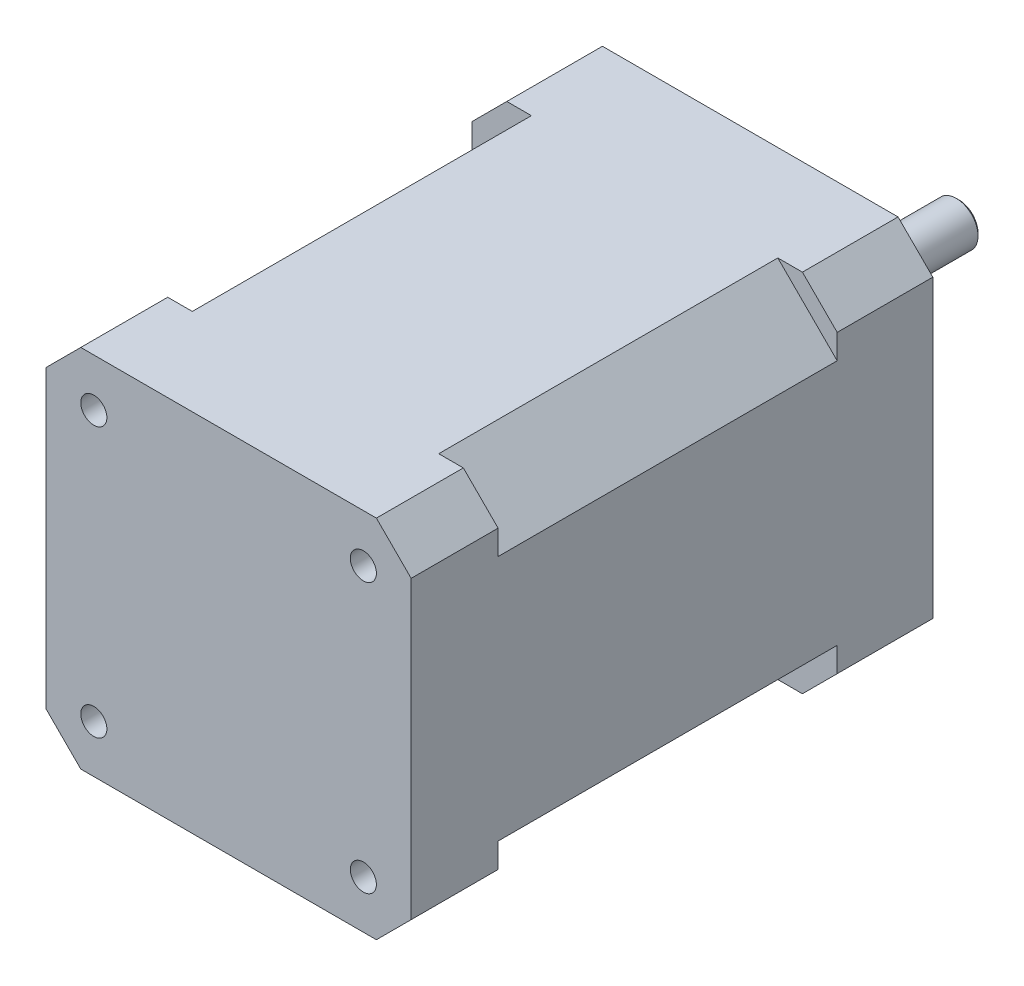
ISO-10303-21;
HEADER;
FILE_DESCRIPTION(('STEP AP214'),'2;1');
FILE_NAME('part.step','',(''),(''),'','','');
FILE_SCHEMA(('AUTOMOTIVE_DESIGN { 1 0 10303 214 1 1 1 1 }'));
ENDSEC;
DATA;
#1=APPLICATION_CONTEXT('core data for automotive mechanical design processes');
#2=APPLICATION_PROTOCOL_DEFINITION('international standard','automotive_design',2000,#1);
#3=PRODUCT_CONTEXT('',#1,'mechanical');
#4=PRODUCT('Part','Part','',(#3));
#5=PRODUCT_RELATED_PRODUCT_CATEGORY('part','',(#4));
#6=PRODUCT_DEFINITION_FORMATION('','',#4);
#7=PRODUCT_DEFINITION_CONTEXT('part definition',#1,'design');
#8=PRODUCT_DEFINITION('design','',#6,#7);
#9=PRODUCT_DEFINITION_SHAPE('','',#8);
#10=(LENGTH_UNIT() NAMED_UNIT(*) SI_UNIT(.MILLI.,.METRE.));
#11=(NAMED_UNIT(*) PLANE_ANGLE_UNIT() SI_UNIT($,.RADIAN.));
#12=(NAMED_UNIT(*) SI_UNIT($,.STERADIAN.) SOLID_ANGLE_UNIT());
#13=UNCERTAINTY_MEASURE_WITH_UNIT(LENGTH_MEASURE(1.E-05),#10,'distance_accuracy_value','');
#14=(GEOMETRIC_REPRESENTATION_CONTEXT(3) GLOBAL_UNCERTAINTY_ASSIGNED_CONTEXT((#13)) GLOBAL_UNIT_ASSIGNED_CONTEXT((#10,
#11,#12)) REPRESENTATION_CONTEXT('',''));
#15=CARTESIAN_POINT('',(0.,0.,0.));
#16=DIRECTION('',(0.,0.,1.));
#17=DIRECTION('',(1.,0.,0.));
#18=AXIS2_PLACEMENT_3D('',#15,#16,#17);
#19=CARTESIAN_POINT('',(8.50746961881451,-12.297619047619,60.));
#20=DIRECTION('',(-0.707106781186547,0.707106781186549,0.));
#21=DIRECTION('',(-0.707106781186549,-0.707106781186546,0.));
#22=AXIS2_PLACEMENT_3D('',#19,#20,#21);
#23=PLANE('',#22);
#24=DIRECTION('',(-0.707106781186548,-0.707106781186547,0.));
#25=VECTOR('',#24,1.);
#26=CARTESIAN_POINT('',(8.50746961881452,-12.297619047619,50.));
#27=LINE('',#26,#25);
#28=CARTESIAN_POINT('',(8.50746961881452,-12.297619047619,50.));
#29=VERTEX_POINT('',#28);
#30=CARTESIAN_POINT('',(4.50746961881449,-16.2976190476191,50.));
#31=VERTEX_POINT('',#30);
#32=EDGE_CURVE('E200',#29,#31,#27,.T.);
#33=ORIENTED_EDGE('',*,*,#32,.F.);
#34=DIRECTION('',(0.,0.,-1.));
#35=VECTOR('',#34,1.);
#36=CARTESIAN_POINT('',(8.50746961881451,-12.297619047619,60.));
#37=LINE('',#36,#35);
#38=CARTESIAN_POINT('',(8.50746961881451,-12.297619047619,60.));
#39=VERTEX_POINT('',#38);
#40=EDGE_CURVE('E212',#39,#29,#37,.T.);
#41=ORIENTED_EDGE('',*,*,#40,.F.);
#42=DIRECTION('',(-0.707106781186549,-0.707106781186546,0.));
#43=VECTOR('',#42,1.);
#44=CARTESIAN_POINT('',(-14.4925303811855,-35.297619047619,60.));
#45=LINE('',#44,#43);
#46=CARTESIAN_POINT('',(4.50746961881449,-16.2976190476191,60.));
#47=VERTEX_POINT('',#46);
#48=EDGE_CURVE('E256',#47,#39,#45,.F.);
#49=ORIENTED_EDGE('',*,*,#48,.F.);
#50=DIRECTION('',(0.,0.,1.));
#51=VECTOR('',#50,1.);
#52=CARTESIAN_POINT('',(4.50746961881449,-16.2976190476191,60.));
#53=LINE('',#52,#51);
#54=EDGE_CURVE('E213',#31,#47,#53,.T.);
#55=ORIENTED_EDGE('',*,*,#54,.F.);
#56=EDGE_LOOP('',(#33,#41,#49,#55));
#57=FACE_BOUND('',#56,.T.);
#58=ADVANCED_FACE('F34',(#57),#23,.F.);
#59=CARTESIAN_POINT('',(-29.4925303811855,-16.2976190476191,60.));
#60=DIRECTION('',(0.707106781186549,0.707106781186546,0.));
#61=DIRECTION('',(-0.707106781186546,0.707106781186549,0.));
#62=AXIS2_PLACEMENT_3D('',#59,#60,#61);
#63=PLANE('',#62);
#64=DIRECTION('',(0.,0.,-1.));
#65=VECTOR('',#64,1.);
#66=CARTESIAN_POINT('',(-29.4925303811855,-16.2976190476191,60.));
#67=LINE('',#66,#65);
#68=CARTESIAN_POINT('',(-29.4925303811855,-16.2976190476191,11.));
#69=VERTEX_POINT('',#68);
#70=CARTESIAN_POINT('',(-29.4925303811855,-16.2976190476191,0.));
#71=VERTEX_POINT('',#70);
#72=EDGE_CURVE('E369',#69,#71,#67,.T.);
#73=ORIENTED_EDGE('',*,*,#72,.F.);
#74=DIRECTION('',(-0.707106781186545,0.70710678118655,0.));
#75=VECTOR('',#74,1.);
#76=CARTESIAN_POINT('',(-29.4925303811855,-16.2976190476191,11.));
#77=LINE('',#76,#75);
#78=CARTESIAN_POINT('',(-33.4925303811855,-12.2976190476191,11.));
#79=VERTEX_POINT('',#78);
#80=EDGE_CURVE('E489',#69,#79,#77,.T.);
#81=ORIENTED_EDGE('',*,*,#80,.T.);
#82=DIRECTION('',(0.,0.,1.));
#83=VECTOR('',#82,1.);
#84=CARTESIAN_POINT('',(-33.4925303811855,-12.2976190476191,60.));
#85=LINE('',#84,#83);
#86=CARTESIAN_POINT('',(-33.4925303811855,-12.297619047619,0.));
#87=VERTEX_POINT('',#86);
#88=EDGE_CURVE('E260',#87,#79,#85,.T.);
#89=ORIENTED_EDGE('',*,*,#88,.F.);
#90=DIRECTION('',(0.707106781186546,-0.707106781186549,0.));
#91=VECTOR('',#90,1.);
#92=CARTESIAN_POINT('',(-29.4925303811855,-16.2976190476191,0.));
#93=LINE('',#92,#91);
#94=EDGE_CURVE('E378',#71,#87,#93,.F.);
#95=ORIENTED_EDGE('',*,*,#94,.F.);
#96=EDGE_LOOP('',(#73,#81,#89,#95));
#97=FACE_BOUND('',#96,.T.);
#98=ADVANCED_FACE('F461',(#97),#63,.F.);
#99=CARTESIAN_POINT('',(-33.4925303811855,21.7023809523809,60.));
#100=DIRECTION('',(0.707106781186546,-0.707106781186549,0.));
#101=DIRECTION('',(0.707106781186549,0.707106781186546,0.));
#102=AXIS2_PLACEMENT_3D('',#99,#100,#101);
#103=PLANE('',#102);
#104=DIRECTION('',(0.,0.,-1.));
#105=VECTOR('',#104,1.);
#106=CARTESIAN_POINT('',(-33.4925303811855,21.7023809523809,60.));
#107=LINE('',#106,#105);
#108=CARTESIAN_POINT('',(-33.4925303811855,21.7023809523809,11.));
#109=VERTEX_POINT('',#108);
#110=CARTESIAN_POINT('',(-33.4925303811855,21.7023809523809,0.));
#111=VERTEX_POINT('',#110);
#112=EDGE_CURVE('E380',#109,#111,#107,.T.);
#113=ORIENTED_EDGE('',*,*,#112,.F.);
#114=DIRECTION('',(0.707106781186549,0.707106781186546,0.));
#115=VECTOR('',#114,1.);
#116=CARTESIAN_POINT('',(-29.4925303811855,25.7023809523809,11.));
#117=LINE('',#116,#115);
#118=CARTESIAN_POINT('',(-29.4925303811855,25.7023809523809,11.));
#119=VERTEX_POINT('',#118);
#120=EDGE_CURVE('E419',#109,#119,#117,.T.);
#121=ORIENTED_EDGE('',*,*,#120,.T.);
#122=DIRECTION('',(0.,0.,1.));
#123=VECTOR('',#122,1.);
#124=CARTESIAN_POINT('',(-29.4925303811855,25.7023809523809,60.));
#125=LINE('',#124,#123);
#126=CARTESIAN_POINT('',(-29.4925303811855,25.7023809523809,0.));
#127=VERTEX_POINT('',#126);
#128=EDGE_CURVE('E12',#127,#119,#125,.T.);
#129=ORIENTED_EDGE('',*,*,#128,.F.);
#130=DIRECTION('',(-0.707106781186549,-0.707106781186546,0.));
#131=VECTOR('',#130,1.);
#132=CARTESIAN_POINT('',(-33.4925303811855,21.7023809523809,0.));
#133=LINE('',#132,#131);
#134=EDGE_CURVE('E374',#111,#127,#133,.F.);
#135=ORIENTED_EDGE('',*,*,#134,.F.);
#136=EDGE_LOOP('',(#113,#121,#129,#135));
#137=FACE_BOUND('',#136,.T.);
#138=ADVANCED_FACE('F417',(#137),#103,.F.);
#139=CARTESIAN_POINT('',(4.50746961881448,25.7023809523809,60.));
#140=DIRECTION('',(-0.707106781186548,-0.707106781186547,0.));
#141=DIRECTION('',(0.707106781186547,-0.707106781186548,0.));
#142=AXIS2_PLACEMENT_3D('',#139,#140,#141);
#143=PLANE('',#142);
#144=DIRECTION('',(0.,0.,-1.));
#145=VECTOR('',#144,1.);
#146=CARTESIAN_POINT('',(4.50746961881448,25.7023809523809,60.));
#147=LINE('',#146,#145);
#148=CARTESIAN_POINT('',(4.50746961881448,25.7023809523809,11.));
#149=VERTEX_POINT('',#148);
#150=CARTESIAN_POINT('',(4.50746961881448,25.7023809523809,0.));
#151=VERTEX_POINT('',#150);
#152=EDGE_CURVE('E220',#149,#151,#147,.T.);
#153=ORIENTED_EDGE('',*,*,#152,.F.);
#154=DIRECTION('',(0.707106781186547,-0.707106781186548,0.));
#155=VECTOR('',#154,1.);
#156=CARTESIAN_POINT('',(8.50746961881451,21.7023809523809,11.));
#157=LINE('',#156,#155);
#158=CARTESIAN_POINT('',(8.50746961881451,21.7023809523809,11.));
#159=VERTEX_POINT('',#158);
#160=EDGE_CURVE('E284',#149,#159,#157,.T.);
#161=ORIENTED_EDGE('',*,*,#160,.T.);
#162=DIRECTION('',(0.,0.,1.));
#163=VECTOR('',#162,1.);
#164=CARTESIAN_POINT('',(8.50746961881451,21.7023809523809,60.));
#165=LINE('',#164,#163);
#166=CARTESIAN_POINT('',(8.50746961881451,21.7023809523809,0.));
#167=VERTEX_POINT('',#166);
#168=EDGE_CURVE('E224',#167,#159,#165,.T.);
#169=ORIENTED_EDGE('',*,*,#168,.F.);
#170=DIRECTION('',(-0.707106781186547,0.707106781186548,0.));
#171=VECTOR('',#170,1.);
#172=CARTESIAN_POINT('',(4.50746961881448,25.7023809523809,0.));
#173=LINE('',#172,#171);
#174=EDGE_CURVE('E282',#151,#167,#173,.F.);
#175=ORIENTED_EDGE('',*,*,#174,.F.);
#176=EDGE_LOOP('',(#153,#161,#169,#175));
#177=FACE_BOUND('',#176,.T.);
#178=ADVANCED_FACE('F281',(#177),#143,.F.);
#179=CARTESIAN_POINT('',(-12.4925303811855,4.70238095238095,-2.));
#180=DIRECTION('',(0.,0.,-1.));
#181=DIRECTION('',(-1.,0.,0.));
#182=AXIS2_PLACEMENT_3D('',#179,#180,#181);
#183=PLANE('',#182);
#184=CARTESIAN_POINT('',(-12.4925303811855,4.70238095238095,-2.));
#185=DIRECTION('',(0.,0.,-1.));
#186=DIRECTION('',(-1.,0.,0.));
#187=AXIS2_PLACEMENT_3D('',#184,#185,#186);
#188=CIRCLE('',#187,11.);
#189=CARTESIAN_POINT('',(-23.4925303811855,4.70238095238095,-2.));
#190=VERTEX_POINT('',#189);
#191=EDGE_CURVE('E316',#190,#190,#188,.T.);
#192=ORIENTED_EDGE('',*,*,#191,.T.);
#193=EDGE_LOOP('',(#192));
#194=FACE_BOUND('',#193,.T.);
#195=CARTESIAN_POINT('',(-12.4925303811855,4.70238095238095,-2.));
#196=DIRECTION('',(0.,0.,-1.));
#197=DIRECTION('',(-1.,0.,0.));
#198=AXIS2_PLACEMENT_3D('',#195,#196,#197);
#199=CIRCLE('',#198,2.5);
#200=CARTESIAN_POINT('',(-14.9925303811855,4.70238095238095,-2.));
#201=VERTEX_POINT('',#200);
#202=EDGE_CURVE('E313',#201,#201,#199,.T.);
#203=ORIENTED_EDGE('',*,*,#202,.F.);
#204=EDGE_LOOP('',(#203));
#205=FACE_BOUND('',#204,.T.);
#206=ADVANCED_FACE('F625',(#194,#205),#183,.T.);
#207=CARTESIAN_POINT('',(-33.4925303811855,-16.2976190476191,0.));
#208=DIRECTION('',(0.,0.,1.));
#209=DIRECTION('',(1.,0.,0.));
#210=AXIS2_PLACEMENT_3D('',#207,#208,#209);
#211=PLANE('',#210);
#212=DIRECTION('',(1.,0.,0.));
#213=VECTOR('',#212,1.);
#214=CARTESIAN_POINT('',(-33.4925303811855,-16.2976190476191,0.));
#215=LINE('',#214,#213);
#216=CARTESIAN_POINT('',(4.50746961881449,-16.2976190476191,0.));
#217=VERTEX_POINT('',#216);
#218=EDGE_CURVE('E352',#71,#217,#215,.T.);
#219=ORIENTED_EDGE('',*,*,#218,.F.);
#220=ORIENTED_EDGE('',*,*,#94,.T.);
#221=DIRECTION('',(0.,-1.,0.));
#222=VECTOR('',#221,1.);
#223=CARTESIAN_POINT('',(-33.4925303811855,25.7023809523809,0.));
#224=LINE('',#223,#222);
#225=EDGE_CURVE('E343',#111,#87,#224,.T.);
#226=ORIENTED_EDGE('',*,*,#225,.F.);
#227=ORIENTED_EDGE('',*,*,#134,.T.);
#228=DIRECTION('',(-1.,0.,0.));
#229=VECTOR('',#228,1.);
#230=CARTESIAN_POINT('',(-33.4925303811855,25.7023809523809,0.));
#231=LINE('',#230,#229);
#232=EDGE_CURVE('E347',#151,#127,#231,.T.);
#233=ORIENTED_EDGE('',*,*,#232,.F.);
#234=ORIENTED_EDGE('',*,*,#174,.T.);
#235=DIRECTION('',(0.,1.,0.));
#236=VECTOR('',#235,1.);
#237=CARTESIAN_POINT('',(8.5074696188145,25.7023809523809,0.));
#238=LINE('',#237,#236);
#239=CARTESIAN_POINT('',(8.50746961881452,-12.297619047619,0.));
#240=VERTEX_POINT('',#239);
#241=EDGE_CURVE('E276',#240,#167,#238,.T.);
#242=ORIENTED_EDGE('',*,*,#241,.F.);
#243=DIRECTION('',(0.707106781186549,0.707106781186546,0.));
#244=VECTOR('',#243,1.);
#245=CARTESIAN_POINT('',(8.50746961881451,-12.297619047619,0.));
#246=LINE('',#245,#244);
#247=EDGE_CURVE('E376',#240,#217,#246,.F.);
#248=ORIENTED_EDGE('',*,*,#247,.T.);
#249=EDGE_LOOP('',(#219,#220,#226,#227,#233,#234,#242,#248));
#250=FACE_BOUND('',#249,.T.);
#251=CARTESIAN_POINT('',(3.00746961881452,20.2023809523809,0.));
#252=DIRECTION('',(0.,0.,-1.));
#253=DIRECTION('',(-1.,0.,0.));
#254=AXIS2_PLACEMENT_3D('',#251,#252,#253);
#255=CIRCLE('',#254,1.5);
#256=CARTESIAN_POINT('',(1.50746961881452,20.2023809523809,0.));
#257=VERTEX_POINT('',#256);
#258=EDGE_CURVE('E337',#257,#257,#255,.T.);
#259=ORIENTED_EDGE('',*,*,#258,.F.);
#260=EDGE_LOOP('',(#259));
#261=FACE_BOUND('',#260,.T.);
#262=CARTESIAN_POINT('',(-27.9925303811855,20.2023809523809,0.));
#263=DIRECTION('',(0.,0.,-1.));
#264=DIRECTION('',(-1.,0.,0.));
#265=AXIS2_PLACEMENT_3D('',#262,#263,#264);
#266=CIRCLE('',#265,1.5);
#267=CARTESIAN_POINT('',(-29.4925303811855,20.2023809523809,0.));
#268=VERTEX_POINT('',#267);
#269=EDGE_CURVE('E331',#268,#268,#266,.T.);
#270=ORIENTED_EDGE('',*,*,#269,.F.);
#271=EDGE_LOOP('',(#270));
#272=FACE_BOUND('',#271,.T.);
#273=CARTESIAN_POINT('',(-27.9925303811855,-10.7976190476191,0.));
#274=DIRECTION('',(0.,0.,-1.));
#275=DIRECTION('',(-1.,0.,0.));
#276=AXIS2_PLACEMENT_3D('',#273,#274,#275);
#277=CIRCLE('',#276,1.5);
#278=CARTESIAN_POINT('',(-29.4925303811855,-10.7976190476191,0.));
#279=VERTEX_POINT('',#278);
#280=EDGE_CURVE('E325',#279,#279,#277,.T.);
#281=ORIENTED_EDGE('',*,*,#280,.F.);
#282=EDGE_LOOP('',(#281));
#283=FACE_BOUND('',#282,.T.);
#284=CARTESIAN_POINT('',(3.00746961881454,-10.7976190476191,0.));
#285=DIRECTION('',(0.,0.,-1.));
#286=DIRECTION('',(-1.,0.,0.));
#287=AXIS2_PLACEMENT_3D('',#284,#285,#286);
#288=CIRCLE('',#287,1.5);
#289=CARTESIAN_POINT('',(1.50746961881454,-10.7976190476191,0.));
#290=VERTEX_POINT('',#289);
#291=EDGE_CURVE('E319',#290,#290,#288,.T.);
#292=ORIENTED_EDGE('',*,*,#291,.F.);
#293=EDGE_LOOP('',(#292));
#294=FACE_BOUND('',#293,.T.);
#295=CARTESIAN_POINT('',(-12.4925303811855,4.70238095238095,0.));
#296=DIRECTION('',(0.,0.,1.));
#297=DIRECTION('',(1.,0.,0.));
#298=AXIS2_PLACEMENT_3D('',#295,#296,#297);
#299=CIRCLE('',#298,11.);
#300=CARTESIAN_POINT('',(-1.49253038118549,4.70238095238095,0.));
#301=VERTEX_POINT('',#300);
#302=EDGE_CURVE('E250',#301,#301,#299,.F.);
#303=ORIENTED_EDGE('',*,*,#302,.F.);
#304=EDGE_LOOP('',(#303));
#305=FACE_BOUND('',#304,.T.);
#306=ADVANCED_FACE('F487',(#250,#261,#272,#283,#294,#305),#211,.F.);
#307=CARTESIAN_POINT('',(-33.4925303811855,25.7023809523809,60.));
#308=DIRECTION('',(1.,0.,0.));
#309=DIRECTION('',(0.,1.,0.));
#310=AXIS2_PLACEMENT_3D('',#307,#308,#309);
#311=PLANE('',#310);
#312=DIRECTION('',(0.,0.,-1.));
#313=VECTOR('',#312,1.);
#314=CARTESIAN_POINT('',(-33.4925303811855,-9.46919192287285,69.6568542494924));
#315=LINE('',#314,#313);
#316=CARTESIAN_POINT('',(-33.4925303811855,-9.46919192287285,50.));
#317=VERTEX_POINT('',#316);
#318=CARTESIAN_POINT('',(-33.4925303811855,-9.46919192287285,11.));
#319=VERTEX_POINT('',#318);
#320=EDGE_CURVE('E431',#317,#319,#315,.T.);
#321=ORIENTED_EDGE('',*,*,#320,.F.);
#322=DIRECTION('',(0.,1.,0.));
#323=VECTOR('',#322,1.);
#324=CARTESIAN_POINT('',(-33.4925303811855,-12.297619047619,50.));
#325=LINE('',#324,#323);
#326=CARTESIAN_POINT('',(-33.4925303811855,-12.297619047619,50.));
#327=VERTEX_POINT('',#326);
#328=EDGE_CURVE('E390',#327,#317,#325,.T.);
#329=ORIENTED_EDGE('',*,*,#328,.F.);
#330=CARTESIAN_POINT('',(-33.4925303811855,-12.297619047619,60.));
#331=VERTEX_POINT('',#330);
#332=EDGE_CURVE('E381',#327,#331,#85,.T.);
#333=ORIENTED_EDGE('',*,*,#332,.T.);
#334=DIRECTION('',(0.,-1.,0.));
#335=VECTOR('',#334,1.);
#336=CARTESIAN_POINT('',(-33.4925303811855,25.7023809523809,60.));
#337=LINE('',#336,#335);
#338=CARTESIAN_POINT('',(-33.4925303811855,21.702380952381,60.));
#339=VERTEX_POINT('',#338);
#340=EDGE_CURVE('E344',#339,#331,#337,.T.);
#341=ORIENTED_EDGE('',*,*,#340,.F.);
#342=CARTESIAN_POINT('',(-33.4925303811855,21.7023809523809,50.));
#343=VERTEX_POINT('',#342);
#344=EDGE_CURVE('E255',#339,#343,#107,.T.);
#345=ORIENTED_EDGE('',*,*,#344,.T.);
#346=DIRECTION('',(0.,1.,0.));
#347=VECTOR('',#346,1.);
#348=CARTESIAN_POINT('',(-33.4925303811855,21.7023809523809,50.));
#349=LINE('',#348,#347);
#350=CARTESIAN_POINT('',(-33.4925303811855,18.8739538276348,50.));
#351=VERTEX_POINT('',#350);
#352=EDGE_CURVE('E441',#351,#343,#349,.T.);
#353=ORIENTED_EDGE('',*,*,#352,.F.);
#354=DIRECTION('',(0.,0.,-1.));
#355=VECTOR('',#354,1.);
#356=CARTESIAN_POINT('',(-33.4925303811855,18.8739538276348,69.6568542494924));
#357=LINE('',#356,#355);
#358=CARTESIAN_POINT('',(-33.4925303811855,18.8739538276348,11.));
#359=VERTEX_POINT('',#358);
#360=EDGE_CURVE('E426',#351,#359,#357,.T.);
#361=ORIENTED_EDGE('',*,*,#360,.T.);
#362=DIRECTION('',(0.,1.,0.));
#363=VECTOR('',#362,1.);
#364=CARTESIAN_POINT('',(-33.4925303811855,21.7023809523809,11.));
#365=LINE('',#364,#363);
#366=EDGE_CURVE('E423',#359,#109,#365,.T.);
#367=ORIENTED_EDGE('',*,*,#366,.T.);
#368=ORIENTED_EDGE('',*,*,#112,.T.);
#369=ORIENTED_EDGE('',*,*,#225,.T.);
#370=ORIENTED_EDGE('',*,*,#88,.T.);
#371=DIRECTION('',(0.,1.,0.));
#372=VECTOR('',#371,1.);
#373=CARTESIAN_POINT('',(-33.4925303811855,-12.297619047619,11.));
#374=LINE('',#373,#372);
#375=EDGE_CURVE('E57',#79,#319,#374,.T.);
#376=ORIENTED_EDGE('',*,*,#375,.T.);
#377=EDGE_LOOP('',(#321,#329,#333,#341,#345,#353,#361,#367,#368,#369,#370,#376));
#378=FACE_BOUND('',#377,.T.);
#379=ADVANCED_FACE('F388',(#378),#311,.F.);
#380=CARTESIAN_POINT('',(-33.4925303811855,-16.2976190476191,60.));
#381=DIRECTION('',(0.,1.,0.));
#382=DIRECTION('',(0.,0.,1.));
#383=AXIS2_PLACEMENT_3D('',#380,#381,#382);
#384=PLANE('',#383);
#385=DIRECTION('',(0.,0.,-1.));
#386=VECTOR('',#385,1.);
#387=CARTESIAN_POINT('',(1.67904249406831,-16.2976190476191,69.6568542494924));
#388=LINE('',#387,#386);
#389=CARTESIAN_POINT('',(1.67904249406831,-16.2976190476191,50.));
#390=VERTEX_POINT('',#389);
#391=CARTESIAN_POINT('',(1.67904249406831,-16.2976190476191,11.));
#392=VERTEX_POINT('',#391);
#393=EDGE_CURVE('E535',#390,#392,#388,.T.);
#394=ORIENTED_EDGE('',*,*,#393,.F.);
#395=DIRECTION('',(-1.,0.,0.));
#396=VECTOR('',#395,1.);
#397=CARTESIAN_POINT('',(4.50746961881449,-16.2976190476191,50.));
#398=LINE('',#397,#396);
#399=EDGE_CURVE('E214',#31,#390,#398,.T.);
#400=ORIENTED_EDGE('',*,*,#399,.F.);
#401=ORIENTED_EDGE('',*,*,#54,.T.);
#402=DIRECTION('',(1.,0.,0.));
#403=VECTOR('',#402,1.);
#404=CARTESIAN_POINT('',(-33.4925303811855,-16.2976190476191,60.));
#405=LINE('',#404,#403);
#406=CARTESIAN_POINT('',(-29.4925303811855,-16.2976190476191,60.));
#407=VERTEX_POINT('',#406);
#408=EDGE_CURVE('E346',#407,#47,#405,.T.);
#409=ORIENTED_EDGE('',*,*,#408,.F.);
#410=CARTESIAN_POINT('',(-29.4925303811855,-16.2976190476191,50.));
#411=VERTEX_POINT('',#410);
#412=EDGE_CURVE('E370',#407,#411,#67,.T.);
#413=ORIENTED_EDGE('',*,*,#412,.T.);
#414=DIRECTION('',(-1.,0.,0.));
#415=VECTOR('',#414,1.);
#416=CARTESIAN_POINT('',(-26.6641032564393,-16.2976190476191,50.));
#417=LINE('',#416,#415);
#418=CARTESIAN_POINT('',(-26.6641032564393,-16.2976190476191,50.));
#419=VERTEX_POINT('',#418);
#420=EDGE_CURVE('E401',#419,#411,#417,.T.);
#421=ORIENTED_EDGE('',*,*,#420,.F.);
#422=DIRECTION('',(0.,0.,-1.));
#423=VECTOR('',#422,1.);
#424=CARTESIAN_POINT('',(-26.6641032564393,-16.2976190476191,69.6568542494924));
#425=LINE('',#424,#423);
#426=CARTESIAN_POINT('',(-26.6641032564393,-16.2976190476191,11.));
#427=VERTEX_POINT('',#426);
#428=EDGE_CURVE('E494',#419,#427,#425,.T.);
#429=ORIENTED_EDGE('',*,*,#428,.T.);
#430=DIRECTION('',(-1.,0.,0.));
#431=VECTOR('',#430,1.);
#432=CARTESIAN_POINT('',(-26.6641032564393,-16.2976190476191,11.));
#433=LINE('',#432,#431);
#434=EDGE_CURVE('E491',#427,#69,#433,.T.);
#435=ORIENTED_EDGE('',*,*,#434,.T.);
#436=ORIENTED_EDGE('',*,*,#72,.T.);
#437=ORIENTED_EDGE('',*,*,#218,.T.);
#438=CARTESIAN_POINT('',(4.50746961881449,-16.2976190476191,11.));
#439=VERTEX_POINT('',#438);
#440=EDGE_CURVE('E366',#217,#439,#53,.T.);
#441=ORIENTED_EDGE('',*,*,#440,.T.);
#442=DIRECTION('',(-1.,0.,0.));
#443=VECTOR('',#442,1.);
#444=CARTESIAN_POINT('',(4.50746961881449,-16.2976190476191,11.));
#445=LINE('',#444,#443);
#446=EDGE_CURVE('E49',#439,#392,#445,.T.);
#447=ORIENTED_EDGE('',*,*,#446,.T.);
#448=EDGE_LOOP('',(#394,#400,#401,#409,#413,#421,#429,#435,#436,#437,#441,#447));
#449=FACE_BOUND('',#448,.T.);
#450=ADVANCED_FACE('F399',(#449),#384,.F.);
#451=CARTESIAN_POINT('',(8.5074696188145,25.7023809523809,60.));
#452=DIRECTION('',(-1.,0.,0.));
#453=DIRECTION('',(0.,-1.,0.));
#454=AXIS2_PLACEMENT_3D('',#451,#452,#453);
#455=PLANE('',#454);
#456=ORIENTED_EDGE('',*,*,#40,.T.);
#457=DIRECTION('',(0.,-1.,0.));
#458=VECTOR('',#457,1.);
#459=CARTESIAN_POINT('',(8.50746961881452,-9.46919192287284,50.));
#460=LINE('',#459,#458);
#461=CARTESIAN_POINT('',(8.50746961881452,-9.46919192287284,50.));
#462=VERTEX_POINT('',#461);
#463=EDGE_CURVE('E196',#462,#29,#460,.T.);
#464=ORIENTED_EDGE('',*,*,#463,.F.);
#465=DIRECTION('',(0.,0.,-1.));
#466=VECTOR('',#465,1.);
#467=CARTESIAN_POINT('',(8.50746961881452,-9.46919192287284,69.6568542494924));
#468=LINE('',#467,#466);
#469=CARTESIAN_POINT('',(8.50746961881452,-9.46919192287284,11.));
#470=VERTEX_POINT('',#469);
#471=EDGE_CURVE('E499',#462,#470,#468,.T.);
#472=ORIENTED_EDGE('',*,*,#471,.T.);
#473=DIRECTION('',(0.,-1.,0.));
#474=VECTOR('',#473,1.);
#475=CARTESIAN_POINT('',(8.50746961881452,-9.46919192287284,11.));
#476=LINE('',#475,#474);
#477=CARTESIAN_POINT('',(8.50746961881452,-12.297619047619,11.));
#478=VERTEX_POINT('',#477);
#479=EDGE_CURVE('E481',#470,#478,#476,.T.);
#480=ORIENTED_EDGE('',*,*,#479,.T.);
#481=EDGE_CURVE('E221',#478,#240,#37,.T.);
#482=ORIENTED_EDGE('',*,*,#481,.T.);
#483=ORIENTED_EDGE('',*,*,#241,.T.);
#484=ORIENTED_EDGE('',*,*,#168,.T.);
#485=DIRECTION('',(0.,-1.,0.));
#486=VECTOR('',#485,1.);
#487=CARTESIAN_POINT('',(8.50746961881452,18.8739538276347,11.));
#488=LINE('',#487,#486);
#489=CARTESIAN_POINT('',(8.50746961881452,18.8739538276347,11.));
#490=VERTEX_POINT('',#489);
#491=EDGE_CURVE('E274',#159,#490,#488,.T.);
#492=ORIENTED_EDGE('',*,*,#491,.T.);
#493=DIRECTION('',(0.,0.,-1.));
#494=VECTOR('',#493,1.);
#495=CARTESIAN_POINT('',(8.50746961881452,18.8739538276347,69.6568542494924));
#496=LINE('',#495,#494);
#497=CARTESIAN_POINT('',(8.50746961881452,18.8739538276347,50.));
#498=VERTEX_POINT('',#497);
#499=EDGE_CURVE('E305',#498,#490,#496,.T.);
#500=ORIENTED_EDGE('',*,*,#499,.F.);
#501=DIRECTION('',(0.,-1.,0.));
#502=VECTOR('',#501,1.);
#503=CARTESIAN_POINT('',(8.50746961881452,18.8739538276347,50.));
#504=LINE('',#503,#502);
#505=CARTESIAN_POINT('',(8.50746961881451,21.7023809523809,50.));
#506=VERTEX_POINT('',#505);
#507=EDGE_CURVE('E302',#506,#498,#504,.T.);
#508=ORIENTED_EDGE('',*,*,#507,.F.);
#509=CARTESIAN_POINT('',(8.50746961881451,21.7023809523809,60.));
#510=VERTEX_POINT('',#509);
#511=EDGE_CURVE('E263',#506,#510,#165,.T.);
#512=ORIENTED_EDGE('',*,*,#511,.T.);
#513=DIRECTION('',(0.,1.,0.));
#514=VECTOR('',#513,1.);
#515=CARTESIAN_POINT('',(8.5074696188145,25.7023809523809,60.));
#516=LINE('',#515,#514);
#517=EDGE_CURVE('E219',#39,#510,#516,.T.);
#518=ORIENTED_EDGE('',*,*,#517,.F.);
#519=EDGE_LOOP('',(#456,#464,#472,#480,#482,#483,#484,#492,#500,#508,#512,#518));
#520=FACE_BOUND('',#519,.T.);
#521=ADVANCED_FACE('F217',(#520),#455,.F.);
#522=CARTESIAN_POINT('',(-33.4925303811855,25.7023809523809,60.));
#523=DIRECTION('',(0.,-1.,0.));
#524=DIRECTION('',(0.,0.,-1.));
#525=AXIS2_PLACEMENT_3D('',#522,#523,#524);
#526=PLANE('',#525);
#527=DIRECTION('',(0.,0.,-1.));
#528=VECTOR('',#527,1.);
#529=CARTESIAN_POINT('',(-26.6641032564393,25.7023809523809,69.6568542494924));
#530=LINE('',#529,#528);
#531=CARTESIAN_POINT('',(-26.6641032564393,25.7023809523809,50.));
#532=VERTEX_POINT('',#531);
#533=CARTESIAN_POINT('',(-26.6641032564393,25.7023809523809,11.));
#534=VERTEX_POINT('',#533);
#535=EDGE_CURVE('E296',#532,#534,#530,.T.);
#536=ORIENTED_EDGE('',*,*,#535,.F.);
#537=DIRECTION('',(1.,0.,0.));
#538=VECTOR('',#537,1.);
#539=CARTESIAN_POINT('',(-26.6641032564393,25.7023809523809,50.));
#540=LINE('',#539,#538);
#541=CARTESIAN_POINT('',(-29.4925303811855,25.7023809523809,50.));
#542=VERTEX_POINT('',#541);
#543=EDGE_CURVE('E239',#542,#532,#540,.T.);
#544=ORIENTED_EDGE('',*,*,#543,.F.);
#545=CARTESIAN_POINT('',(-29.4925303811855,25.702380952381,60.));
#546=VERTEX_POINT('',#545);
#547=EDGE_CURVE('E42',#542,#546,#125,.T.);
#548=ORIENTED_EDGE('',*,*,#547,.T.);
#549=DIRECTION('',(-1.,0.,0.));
#550=VECTOR('',#549,1.);
#551=CARTESIAN_POINT('',(-33.4925303811855,25.7023809523809,60.));
#552=LINE('',#551,#550);
#553=CARTESIAN_POINT('',(4.50746961881448,25.7023809523809,60.));
#554=VERTEX_POINT('',#553);
#555=EDGE_CURVE('E237',#554,#546,#552,.T.);
#556=ORIENTED_EDGE('',*,*,#555,.F.);
#557=CARTESIAN_POINT('',(4.50746961881448,25.7023809523809,50.));
#558=VERTEX_POINT('',#557);
#559=EDGE_CURVE('E223',#554,#558,#147,.T.);
#560=ORIENTED_EDGE('',*,*,#559,.T.);
#561=DIRECTION('',(1.,0.,0.));
#562=VECTOR('',#561,1.);
#563=CARTESIAN_POINT('',(4.50746961881448,25.7023809523809,50.));
#564=LINE('',#563,#562);
#565=CARTESIAN_POINT('',(1.6790424940683,25.7023809523809,50.));
#566=VERTEX_POINT('',#565);
#567=EDGE_CURVE('E308',#566,#558,#564,.T.);
#568=ORIENTED_EDGE('',*,*,#567,.F.);
#569=DIRECTION('',(0.,0.,-1.));
#570=VECTOR('',#569,1.);
#571=CARTESIAN_POINT('',(1.6790424940683,25.7023809523809,69.6568542494924));
#572=LINE('',#571,#570);
#573=CARTESIAN_POINT('',(1.6790424940683,25.7023809523809,11.));
#574=VERTEX_POINT('',#573);
#575=EDGE_CURVE('E291',#566,#574,#572,.T.);
#576=ORIENTED_EDGE('',*,*,#575,.T.);
#577=DIRECTION('',(1.,0.,0.));
#578=VECTOR('',#577,1.);
#579=CARTESIAN_POINT('',(4.50746961881448,25.7023809523809,11.));
#580=LINE('',#579,#578);
#581=EDGE_CURVE('E288',#574,#149,#580,.T.);
#582=ORIENTED_EDGE('',*,*,#581,.T.);
#583=ORIENTED_EDGE('',*,*,#152,.T.);
#584=ORIENTED_EDGE('',*,*,#232,.T.);
#585=ORIENTED_EDGE('',*,*,#128,.T.);
#586=DIRECTION('',(1.,0.,0.));
#587=VECTOR('',#586,1.);
#588=CARTESIAN_POINT('',(-26.6641032564393,25.7023809523809,11.));
#589=LINE('',#588,#587);
#590=EDGE_CURVE('E436',#119,#534,#589,.T.);
#591=ORIENTED_EDGE('',*,*,#590,.T.);
#592=EDGE_LOOP('',(#536,#544,#548,#556,#560,#568,#576,#582,#583,#584,#585,#591));
#593=FACE_BOUND('',#592,.T.);
#594=ADVANCED_FACE('F236',(#593),#526,.F.);
#595=CARTESIAN_POINT('',(-33.4925303811855,-16.2976190476191,60.));
#596=DIRECTION('',(0.,0.,1.));
#597=DIRECTION('',(1.,0.,0.));
#598=AXIS2_PLACEMENT_3D('',#595,#596,#597);
#599=PLANE('',#598);
#600=CARTESIAN_POINT('',(3.00746961881454,-10.7976190476191,60.));
#601=DIRECTION('',(0.,0.,1.));
#602=DIRECTION('',(1.,0.,0.));
#603=AXIS2_PLACEMENT_3D('',#600,#601,#602);
#604=CIRCLE('',#603,1.5);
#605=CARTESIAN_POINT('',(4.50746961881454,-10.7976190476191,60.));
#606=VERTEX_POINT('',#605);
#607=EDGE_CURVE('E322',#606,#606,#604,.T.);
#608=ORIENTED_EDGE('',*,*,#607,.F.);
#609=EDGE_LOOP('',(#608));
#610=FACE_BOUND('',#609,.T.);
#611=CARTESIAN_POINT('',(-27.9925303811855,-10.7976190476191,60.));
#612=DIRECTION('',(0.,0.,1.));
#613=DIRECTION('',(1.,0.,0.));
#614=AXIS2_PLACEMENT_3D('',#611,#612,#613);
#615=CIRCLE('',#614,1.5);
#616=CARTESIAN_POINT('',(-26.4925303811855,-10.7976190476191,60.));
#617=VERTEX_POINT('',#616);
#618=EDGE_CURVE('E328',#617,#617,#615,.T.);
#619=ORIENTED_EDGE('',*,*,#618,.F.);
#620=EDGE_LOOP('',(#619));
#621=FACE_BOUND('',#620,.T.);
#622=CARTESIAN_POINT('',(-27.9925303811855,20.2023809523809,60.));
#623=DIRECTION('',(0.,0.,1.));
#624=DIRECTION('',(1.,0.,0.));
#625=AXIS2_PLACEMENT_3D('',#622,#623,#624);
#626=CIRCLE('',#625,1.5);
#627=CARTESIAN_POINT('',(-26.4925303811855,20.2023809523809,60.));
#628=VERTEX_POINT('',#627);
#629=EDGE_CURVE('E334',#628,#628,#626,.T.);
#630=ORIENTED_EDGE('',*,*,#629,.F.);
#631=EDGE_LOOP('',(#630));
#632=FACE_BOUND('',#631,.T.);
#633=CARTESIAN_POINT('',(3.00746961881452,20.2023809523809,60.));
#634=DIRECTION('',(0.,0.,1.));
#635=DIRECTION('',(1.,0.,0.));
#636=AXIS2_PLACEMENT_3D('',#633,#634,#635);
#637=CIRCLE('',#636,1.5);
#638=CARTESIAN_POINT('',(4.50746961881452,20.2023809523809,60.));
#639=VERTEX_POINT('',#638);
#640=EDGE_CURVE('E340',#639,#639,#637,.T.);
#641=ORIENTED_EDGE('',*,*,#640,.F.);
#642=EDGE_LOOP('',(#641));
#643=FACE_BOUND('',#642,.T.);
#644=ORIENTED_EDGE('',*,*,#340,.T.);
#645=DIRECTION('',(-0.707106781186546,0.707106781186549,0.));
#646=VECTOR('',#645,1.);
#647=CARTESIAN_POINT('',(-31.4925303811855,-14.2976190476191,60.));
#648=LINE('',#647,#646);
#649=EDGE_CURVE('E258',#331,#407,#648,.F.);
#650=ORIENTED_EDGE('',*,*,#649,.T.);
#651=ORIENTED_EDGE('',*,*,#408,.T.);
#652=ORIENTED_EDGE('',*,*,#48,.T.);
#653=ORIENTED_EDGE('',*,*,#517,.T.);
#654=DIRECTION('',(0.707106781186547,-0.707106781186548,0.));
#655=VECTOR('',#654,1.);
#656=CARTESIAN_POINT('',(6.50746961881452,23.7023809523809,60.));
#657=LINE('',#656,#655);
#658=EDGE_CURVE('E249',#510,#554,#657,.F.);
#659=ORIENTED_EDGE('',*,*,#658,.T.);
#660=ORIENTED_EDGE('',*,*,#555,.T.);
#661=DIRECTION('',(0.707106781186549,0.707106781186546,0.));
#662=VECTOR('',#661,1.);
#663=CARTESIAN_POINT('',(-52.4925303811855,2.70238095238102,60.));
#664=LINE('',#663,#662);
#665=EDGE_CURVE('E246',#546,#339,#664,.F.);
#666=ORIENTED_EDGE('',*,*,#665,.T.);
#667=EDGE_LOOP('',(#644,#650,#651,#652,#653,#659,#660,#666));
#668=FACE_BOUND('',#667,.T.);
#669=ADVANCED_FACE('F245',(#610,#621,#632,#643,#668),#599,.T.);
#670=CARTESIAN_POINT('',(3.00746961881452,20.2023809523809,65.));
#671=DIRECTION('',(0.,0.,-1.));
#672=DIRECTION('',(-1.,0.,0.));
#673=AXIS2_PLACEMENT_3D('',#670,#671,#672);
#674=CYLINDRICAL_SURFACE('',#673,1.5);
#675=ORIENTED_EDGE('',*,*,#640,.T.);
#676=EDGE_LOOP('',(#675));
#677=FACE_BOUND('',#676,.T.);
#678=ORIENTED_EDGE('',*,*,#258,.T.);
#679=EDGE_LOOP('',(#678));
#680=FACE_BOUND('',#679,.T.);
#681=ADVANCED_FACE('F722',(#677,#680),#674,.F.);
#682=CARTESIAN_POINT('',(-27.9925303811855,20.2023809523809,65.));
#683=DIRECTION('',(0.,0.,-1.));
#684=DIRECTION('',(-1.,0.,0.));
#685=AXIS2_PLACEMENT_3D('',#682,#683,#684);
#686=CYLINDRICAL_SURFACE('',#685,1.5);
#687=ORIENTED_EDGE('',*,*,#629,.T.);
#688=EDGE_LOOP('',(#687));
#689=FACE_BOUND('',#688,.T.);
#690=ORIENTED_EDGE('',*,*,#269,.T.);
#691=EDGE_LOOP('',(#690));
#692=FACE_BOUND('',#691,.T.);
#693=ADVANCED_FACE('F713',(#689,#692),#686,.F.);
#694=CARTESIAN_POINT('',(-27.9925303811855,-10.7976190476191,65.));
#695=DIRECTION('',(0.,0.,-1.));
#696=DIRECTION('',(-1.,0.,0.));
#697=AXIS2_PLACEMENT_3D('',#694,#695,#696);
#698=CYLINDRICAL_SURFACE('',#697,1.5);
#699=ORIENTED_EDGE('',*,*,#618,.T.);
#700=EDGE_LOOP('',(#699));
#701=FACE_BOUND('',#700,.T.);
#702=ORIENTED_EDGE('',*,*,#280,.T.);
#703=EDGE_LOOP('',(#702));
#704=FACE_BOUND('',#703,.T.);
#705=ADVANCED_FACE('F704',(#701,#704),#698,.F.);
#706=CARTESIAN_POINT('',(3.00746961881454,-10.7976190476191,65.));
#707=DIRECTION('',(0.,0.,-1.));
#708=DIRECTION('',(-1.,0.,0.));
#709=AXIS2_PLACEMENT_3D('',#706,#707,#708);
#710=CYLINDRICAL_SURFACE('',#709,1.5);
#711=ORIENTED_EDGE('',*,*,#607,.T.);
#712=EDGE_LOOP('',(#711));
#713=FACE_BOUND('',#712,.T.);
#714=ORIENTED_EDGE('',*,*,#291,.T.);
#715=EDGE_LOOP('',(#714));
#716=FACE_BOUND('',#715,.T.);
#717=ADVANCED_FACE('F689',(#713,#716),#710,.F.);
#718=CARTESIAN_POINT('',(-12.4925303811855,4.70238095238095,-2.));
#719=DIRECTION('',(0.,0.,1.));
#720=DIRECTION('',(1.,0.,0.));
#721=AXIS2_PLACEMENT_3D('',#718,#719,#720);
#722=CYLINDRICAL_SURFACE('',#721,11.);
#723=ORIENTED_EDGE('',*,*,#191,.F.);
#724=EDGE_LOOP('',(#723));
#725=FACE_BOUND('',#724,.T.);
#726=ORIENTED_EDGE('',*,*,#302,.T.);
#727=EDGE_LOOP('',(#726));
#728=FACE_BOUND('',#727,.T.);
#729=ADVANCED_FACE('F672',(#725,#728),#722,.T.);
#730=CARTESIAN_POINT('',(-12.4925303811855,4.70238095238095,-24.));
#731=DIRECTION('',(0.,0.,1.));
#732=DIRECTION('',(1.,0.,0.));
#733=AXIS2_PLACEMENT_3D('',#730,#731,#732);
#734=CYLINDRICAL_SURFACE('',#733,2.5);
#735=CARTESIAN_POINT('',(-12.4925303811855,4.70238095238095,-23.7));
#736=DIRECTION('',(0.,0.,-1.));
#737=DIRECTION('',(-1.,0.,0.));
#738=AXIS2_PLACEMENT_3D('',#735,#736,#737);
#739=CIRCLE('',#738,2.5);
#740=CARTESIAN_POINT('',(-14.9925303811855,4.70238095238095,-23.7));
#741=VERTEX_POINT('',#740);
#742=EDGE_CURVE('E363',#741,#741,#739,.F.);
#743=ORIENTED_EDGE('',*,*,#742,.T.);
#744=EDGE_LOOP('',(#743));
#745=FACE_BOUND('',#744,.T.);
#746=ORIENTED_EDGE('',*,*,#202,.T.);
#747=EDGE_LOOP('',(#746));
#748=FACE_BOUND('',#747,.T.);
#749=ADVANCED_FACE('F663',(#745,#748),#734,.T.);
#750=CARTESIAN_POINT('',(-12.4925303811855,4.70238095238095,-24.));
#751=DIRECTION('',(0.,0.,-1.));
#752=DIRECTION('',(-1.,0.,0.));
#753=AXIS2_PLACEMENT_3D('',#750,#751,#752);
#754=PLANE('',#753);
#755=CARTESIAN_POINT('',(-12.4925303811855,4.70238095238095,-24.));
#756=DIRECTION('',(0.,0.,-1.));
#757=DIRECTION('',(-1.,0.,0.));
#758=AXIS2_PLACEMENT_3D('',#755,#756,#757);
#759=CIRCLE('',#758,2.19999999999999);
#760=CARTESIAN_POINT('',(-14.6925303811855,4.70238095238095,-24.));
#761=VERTEX_POINT('',#760);
#762=EDGE_CURVE('E360',#761,#761,#759,.T.);
#763=ORIENTED_EDGE('',*,*,#762,.T.);
#764=EDGE_LOOP('',(#763));
#765=FACE_BOUND('',#764,.T.);
#766=ADVANCED_FACE('F653',(#765),#754,.T.);
#767=CARTESIAN_POINT('',(-12.4925303811855,4.70238095238095,-24.));
#768=DIRECTION('',(0.,0.,1.));
#769=DIRECTION('',(1.,0.,0.));
#770=AXIS2_PLACEMENT_3D('',#767,#768,#769);
#771=CONICAL_SURFACE('',#770,2.19999999999999,0.785398163397463);
#772=ORIENTED_EDGE('',*,*,#742,.F.);
#773=EDGE_LOOP('',(#772));
#774=FACE_BOUND('',#773,.T.);
#775=ORIENTED_EDGE('',*,*,#762,.F.);
#776=EDGE_LOOP('',(#775));
#777=FACE_BOUND('',#776,.T.);
#778=ADVANCED_FACE('F475',(#774,#777),#771,.T.);
#779=DIRECTION('',(-0.707106781186545,0.70710678118655,0.));
#780=VECTOR('',#779,1.);
#781=CARTESIAN_POINT('',(-29.4925303811855,-16.2976190476191,50.));
#782=LINE('',#781,#780);
#783=EDGE_CURVE('E395',#411,#327,#782,.T.);
#784=ORIENTED_EDGE('',*,*,#783,.F.);
#785=ORIENTED_EDGE('',*,*,#412,.F.);
#786=ORIENTED_EDGE('',*,*,#649,.F.);
#787=ORIENTED_EDGE('',*,*,#332,.F.);
#788=EDGE_LOOP('',(#784,#785,#786,#787));
#789=FACE_BOUND('',#788,.T.);
#790=ADVANCED_FACE('F394',(#789),#63,.F.);
#791=DIRECTION('',(-0.707106781186548,-0.707106781186547,0.));
#792=VECTOR('',#791,1.);
#793=CARTESIAN_POINT('',(8.50746961881452,-12.297619047619,11.));
#794=LINE('',#793,#792);
#795=EDGE_CURVE('E478',#478,#439,#794,.T.);
#796=ORIENTED_EDGE('',*,*,#795,.T.);
#797=ORIENTED_EDGE('',*,*,#440,.F.);
#798=ORIENTED_EDGE('',*,*,#247,.F.);
#799=ORIENTED_EDGE('',*,*,#481,.F.);
#800=EDGE_LOOP('',(#796,#797,#798,#799));
#801=FACE_BOUND('',#800,.T.);
#802=ADVANCED_FACE('F463',(#801),#23,.F.);
#803=DIRECTION('',(0.707106781186549,0.707106781186546,0.));
#804=VECTOR('',#803,1.);
#805=CARTESIAN_POINT('',(-29.4925303811855,25.7023809523809,50.));
#806=LINE('',#805,#804);
#807=EDGE_CURVE('E439',#343,#542,#806,.T.);
#808=ORIENTED_EDGE('',*,*,#807,.F.);
#809=ORIENTED_EDGE('',*,*,#344,.F.);
#810=ORIENTED_EDGE('',*,*,#665,.F.);
#811=ORIENTED_EDGE('',*,*,#547,.F.);
#812=EDGE_LOOP('',(#808,#809,#810,#811));
#813=FACE_BOUND('',#812,.T.);
#814=ADVANCED_FACE('F253',(#813),#103,.F.);
#815=DIRECTION('',(0.707106781186547,-0.707106781186548,0.));
#816=VECTOR('',#815,1.);
#817=CARTESIAN_POINT('',(8.50746961881451,21.7023809523809,50.));
#818=LINE('',#817,#816);
#819=EDGE_CURVE('E306',#558,#506,#818,.T.);
#820=ORIENTED_EDGE('',*,*,#819,.F.);
#821=ORIENTED_EDGE('',*,*,#559,.F.);
#822=ORIENTED_EDGE('',*,*,#658,.F.);
#823=ORIENTED_EDGE('',*,*,#511,.F.);
#824=EDGE_LOOP('',(#820,#821,#822,#823));
#825=FACE_BOUND('',#824,.T.);
#826=ADVANCED_FACE('F36',(#825),#143,.F.);
#827=CARTESIAN_POINT('',(-33.4925303811855,-16.2976190476191,50.));
#828=DIRECTION('',(0.,0.,1.));
#829=DIRECTION('',(1.,0.,0.));
#830=AXIS2_PLACEMENT_3D('',#827,#828,#829);
#831=PLANE('',#830);
#832=ORIENTED_EDGE('',*,*,#507,.T.);
#833=DIRECTION('',(-0.707106781186547,0.707106781186548,0.));
#834=VECTOR('',#833,1.);
#835=CARTESIAN_POINT('',(8.50746961881452,18.8739538276347,50.));
#836=LINE('',#835,#834);
#837=EDGE_CURVE('E287',#498,#566,#836,.T.);
#838=ORIENTED_EDGE('',*,*,#837,.T.);
#839=ORIENTED_EDGE('',*,*,#567,.T.);
#840=ORIENTED_EDGE('',*,*,#819,.T.);
#841=EDGE_LOOP('',(#832,#838,#839,#840));
#842=FACE_BOUND('',#841,.T.);
#843=ADVANCED_FACE('F405',(#842),#831,.F.);
#844=CARTESIAN_POINT('',(8.50746961881449,25.7023809523809,11.));
#845=DIRECTION('',(0.,0.,1.));
#846=DIRECTION('',(1.,0.,0.));
#847=AXIS2_PLACEMENT_3D('',#844,#845,#846);
#848=PLANE('',#847);
#849=ORIENTED_EDGE('',*,*,#491,.F.);
#850=ORIENTED_EDGE('',*,*,#160,.F.);
#851=ORIENTED_EDGE('',*,*,#581,.F.);
#852=DIRECTION('',(-0.707106781186547,0.707106781186548,0.));
#853=VECTOR('',#852,1.);
#854=CARTESIAN_POINT('',(8.50746961881452,18.8739538276347,11.));
#855=LINE('',#854,#853);
#856=EDGE_CURVE('E293',#490,#574,#855,.T.);
#857=ORIENTED_EDGE('',*,*,#856,.F.);
#858=EDGE_LOOP('',(#849,#850,#851,#857));
#859=FACE_BOUND('',#858,.T.);
#860=ADVANCED_FACE('F409',(#859),#848,.T.);
#861=CARTESIAN_POINT('',(8.50746961881452,18.8739538276347,69.6568542494924));
#862=DIRECTION('',(-0.707106781186548,-0.707106781186547,0.));
#863=DIRECTION('',(0.707106781186547,-0.707106781186548,0.));
#864=AXIS2_PLACEMENT_3D('',#861,#862,#863);
#865=PLANE('',#864);
#866=ORIENTED_EDGE('',*,*,#499,.T.);
#867=ORIENTED_EDGE('',*,*,#856,.T.);
#868=ORIENTED_EDGE('',*,*,#575,.F.);
#869=ORIENTED_EDGE('',*,*,#837,.F.);
#870=EDGE_LOOP('',(#866,#867,#868,#869));
#871=FACE_BOUND('',#870,.T.);
#872=ADVANCED_FACE('F408',(#871),#865,.F.);
#873=CARTESIAN_POINT('',(-33.4925303811855,-16.2976190476191,50.));
#874=DIRECTION('',(0.,0.,1.));
#875=DIRECTION('',(1.,0.,0.));
#876=AXIS2_PLACEMENT_3D('',#873,#874,#875);
#877=PLANE('',#876);
#878=ORIENTED_EDGE('',*,*,#543,.T.);
#879=DIRECTION('',(-0.707106781186548,-0.707106781186548,0.));
#880=VECTOR('',#879,1.);
#881=CARTESIAN_POINT('',(-26.6641032564393,25.7023809523809,50.));
#882=LINE('',#881,#880);
#883=EDGE_CURVE('E422',#532,#351,#882,.T.);
#884=ORIENTED_EDGE('',*,*,#883,.T.);
#885=ORIENTED_EDGE('',*,*,#352,.T.);
#886=ORIENTED_EDGE('',*,*,#807,.T.);
#887=EDGE_LOOP('',(#878,#884,#885,#886));
#888=FACE_BOUND('',#887,.T.);
#889=ADVANCED_FACE('F448',(#888),#877,.F.);
#890=CARTESIAN_POINT('',(-33.4925303811855,25.7023809523809,11.));
#891=DIRECTION('',(0.,0.,1.));
#892=DIRECTION('',(1.,0.,0.));
#893=AXIS2_PLACEMENT_3D('',#890,#891,#892);
#894=PLANE('',#893);
#895=ORIENTED_EDGE('',*,*,#590,.F.);
#896=ORIENTED_EDGE('',*,*,#120,.F.);
#897=ORIENTED_EDGE('',*,*,#366,.F.);
#898=DIRECTION('',(-0.707106781186547,-0.707106781186547,0.));
#899=VECTOR('',#898,1.);
#900=CARTESIAN_POINT('',(-26.6641032564393,25.7023809523809,11.));
#901=LINE('',#900,#899);
#902=EDGE_CURVE('E428',#534,#359,#901,.T.);
#903=ORIENTED_EDGE('',*,*,#902,.F.);
#904=EDGE_LOOP('',(#895,#896,#897,#903));
#905=FACE_BOUND('',#904,.T.);
#906=ADVANCED_FACE('F449',(#905),#894,.T.);
#907=CARTESIAN_POINT('',(-26.6641032564393,25.7023809523809,69.6568542494924));
#908=DIRECTION('',(0.707106781186548,-0.707106781186548,0.));
#909=DIRECTION('',(0.707106781186548,0.707106781186548,0.));
#910=AXIS2_PLACEMENT_3D('',#907,#908,#909);
#911=PLANE('',#910);
#912=ORIENTED_EDGE('',*,*,#535,.T.);
#913=ORIENTED_EDGE('',*,*,#902,.T.);
#914=ORIENTED_EDGE('',*,*,#360,.F.);
#915=ORIENTED_EDGE('',*,*,#883,.F.);
#916=EDGE_LOOP('',(#912,#913,#914,#915));
#917=FACE_BOUND('',#916,.T.);
#918=ADVANCED_FACE('F445',(#917),#911,.F.);
#919=CARTESIAN_POINT('',(-33.4925303811855,-16.2976190476191,50.));
#920=DIRECTION('',(0.,0.,1.));
#921=DIRECTION('',(1.,0.,0.));
#922=AXIS2_PLACEMENT_3D('',#919,#920,#921);
#923=PLANE('',#922);
#924=ORIENTED_EDGE('',*,*,#328,.T.);
#925=DIRECTION('',(0.707106781186547,-0.707106781186548,0.));
#926=VECTOR('',#925,1.);
#927=CARTESIAN_POINT('',(-33.4925303811855,-9.46919192287285,50.));
#928=LINE('',#927,#926);
#929=EDGE_CURVE('E490',#317,#419,#928,.T.);
#930=ORIENTED_EDGE('',*,*,#929,.T.);
#931=ORIENTED_EDGE('',*,*,#420,.T.);
#932=ORIENTED_EDGE('',*,*,#783,.T.);
#933=EDGE_LOOP('',(#924,#930,#931,#932));
#934=FACE_BOUND('',#933,.T.);
#935=ADVANCED_FACE('F456',(#934),#923,.F.);
#936=CARTESIAN_POINT('',(-33.4925303811855,-16.2976190476191,11.));
#937=DIRECTION('',(0.,0.,1.));
#938=DIRECTION('',(1.,0.,0.));
#939=AXIS2_PLACEMENT_3D('',#936,#937,#938);
#940=PLANE('',#939);
#941=ORIENTED_EDGE('',*,*,#375,.F.);
#942=ORIENTED_EDGE('',*,*,#80,.F.);
#943=ORIENTED_EDGE('',*,*,#434,.F.);
#944=DIRECTION('',(0.707106781186547,-0.707106781186548,0.));
#945=VECTOR('',#944,1.);
#946=CARTESIAN_POINT('',(-33.4925303811855,-9.46919192287285,11.));
#947=LINE('',#946,#945);
#948=EDGE_CURVE('E496',#319,#427,#947,.T.);
#949=ORIENTED_EDGE('',*,*,#948,.F.);
#950=EDGE_LOOP('',(#941,#942,#943,#949));
#951=FACE_BOUND('',#950,.T.);
#952=ADVANCED_FACE('F510',(#951),#940,.T.);
#953=CARTESIAN_POINT('',(-33.4925303811855,-9.46919192287285,69.6568542494924));
#954=DIRECTION('',(0.707106781186548,0.707106781186547,0.));
#955=DIRECTION('',(-0.707106781186547,0.707106781186548,0.));
#956=AXIS2_PLACEMENT_3D('',#953,#954,#955);
#957=PLANE('',#956);
#958=ORIENTED_EDGE('',*,*,#320,.T.);
#959=ORIENTED_EDGE('',*,*,#948,.T.);
#960=ORIENTED_EDGE('',*,*,#428,.F.);
#961=ORIENTED_EDGE('',*,*,#929,.F.);
#962=EDGE_LOOP('',(#958,#959,#960,#961));
#963=FACE_BOUND('',#962,.T.);
#964=ADVANCED_FACE('F508',(#963),#957,.F.);
#965=CARTESIAN_POINT('',(-33.4925303811855,-16.2976190476191,50.));
#966=DIRECTION('',(0.,0.,1.));
#967=DIRECTION('',(1.,0.,0.));
#968=AXIS2_PLACEMENT_3D('',#965,#966,#967);
#969=PLANE('',#968);
#970=DIRECTION('',(0.707106781186548,0.707106781186547,0.));
#971=VECTOR('',#970,1.);
#972=CARTESIAN_POINT('',(1.67904249406831,-16.2976190476191,50.));
#973=LINE('',#972,#971);
#974=EDGE_CURVE('E202',#390,#462,#973,.T.);
#975=ORIENTED_EDGE('',*,*,#974,.T.);
#976=ORIENTED_EDGE('',*,*,#463,.T.);
#977=ORIENTED_EDGE('',*,*,#32,.T.);
#978=ORIENTED_EDGE('',*,*,#399,.T.);
#979=EDGE_LOOP('',(#975,#976,#977,#978));
#980=FACE_BOUND('',#979,.T.);
#981=ADVANCED_FACE('F198',(#980),#969,.F.);
#982=CARTESIAN_POINT('',(8.50746961881452,-9.46919192287284,11.));
#983=DIRECTION('',(0.,0.,-1.));
#984=DIRECTION('',(-1.,0.,0.));
#985=AXIS2_PLACEMENT_3D('',#982,#983,#984);
#986=PLANE('',#985);
#987=DIRECTION('',(0.707106781186548,0.707106781186547,0.));
#988=VECTOR('',#987,1.);
#989=CARTESIAN_POINT('',(1.67904249406831,-16.2976190476191,11.));
#990=LINE('',#989,#988);
#991=EDGE_CURVE('E530',#392,#470,#990,.T.);
#992=ORIENTED_EDGE('',*,*,#991,.F.);
#993=ORIENTED_EDGE('',*,*,#446,.F.);
#994=ORIENTED_EDGE('',*,*,#795,.F.);
#995=ORIENTED_EDGE('',*,*,#479,.F.);
#996=EDGE_LOOP('',(#992,#993,#994,#995));
#997=FACE_BOUND('',#996,.T.);
#998=ADVANCED_FACE('F521',(#997),#986,.F.);
#999=CARTESIAN_POINT('',(1.67904249406831,-16.2976190476191,69.6568542494924));
#1000=DIRECTION('',(-0.707106781186548,0.707106781186548,0.));
#1001=DIRECTION('',(-0.707106781186548,-0.707106781186547,0.));
#1002=AXIS2_PLACEMENT_3D('',#999,#1000,#1001);
#1003=PLANE('',#1002);
#1004=ORIENTED_EDGE('',*,*,#393,.T.);
#1005=ORIENTED_EDGE('',*,*,#991,.T.);
#1006=ORIENTED_EDGE('',*,*,#471,.F.);
#1007=ORIENTED_EDGE('',*,*,#974,.F.);
#1008=EDGE_LOOP('',(#1004,#1005,#1006,#1007));
#1009=FACE_BOUND('',#1008,.T.);
#1010=ADVANCED_FACE('F522',(#1009),#1003,.F.);
#1011=CLOSED_SHELL('',(#58,#98,#138,#178,#206,#306,#379,#450,#521,#594,#669,#681,#693,#705,#717,
#729,#749,#766,#778,#790,#802,#814,#826,#843,#860,#872,#889,#906,#918,#935,#952,#964,#981,#998,#1010));
#1012=MANIFOLD_SOLID_BREP('B2',#1011);
#1013=ADVANCED_BREP_SHAPE_REPRESENTATION('',(#18,#1012),#14);
#1014=SHAPE_DEFINITION_REPRESENTATION(#9,#1013);
ENDSEC;
END-ISO-10303-21;
